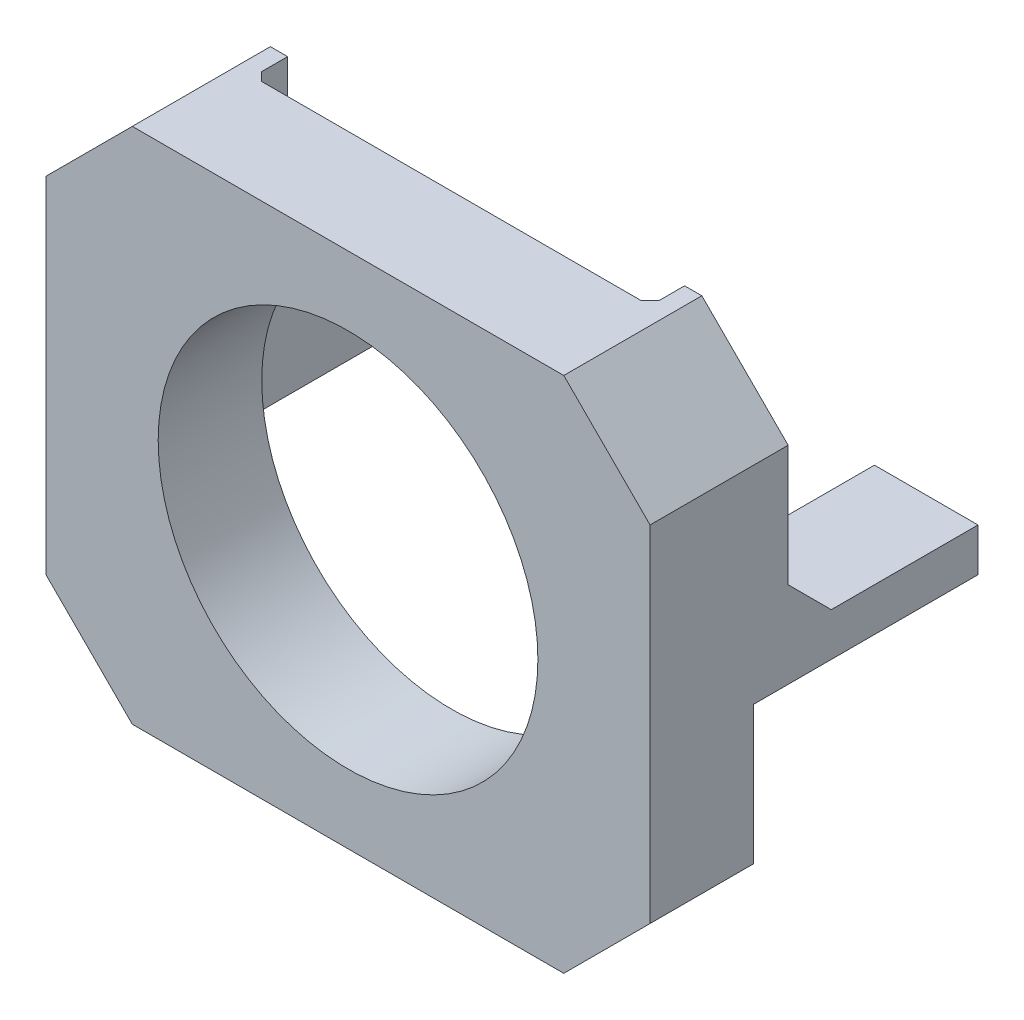
ISO-10303-21;
HEADER;
FILE_DESCRIPTION(('STEP AP214'),'2;1');
FILE_NAME('part.step','',(''),(''),'','','');
FILE_SCHEMA(('AUTOMOTIVE_DESIGN { 1 0 10303 214 1 1 1 1 }'));
ENDSEC;
DATA;
#1=APPLICATION_CONTEXT('core data for automotive mechanical design processes');
#2=APPLICATION_PROTOCOL_DEFINITION('international standard','automotive_design',2000,#1);
#3=PRODUCT_CONTEXT('',#1,'mechanical');
#4=PRODUCT('Part','Part','',(#3));
#5=PRODUCT_RELATED_PRODUCT_CATEGORY('part','',(#4));
#6=PRODUCT_DEFINITION_FORMATION('','',#4);
#7=PRODUCT_DEFINITION_CONTEXT('part definition',#1,'design');
#8=PRODUCT_DEFINITION('design','',#6,#7);
#9=PRODUCT_DEFINITION_SHAPE('','',#8);
#10=(LENGTH_UNIT() NAMED_UNIT(*) SI_UNIT(.MILLI.,.METRE.));
#11=(NAMED_UNIT(*) PLANE_ANGLE_UNIT() SI_UNIT($,.RADIAN.));
#12=(NAMED_UNIT(*) SI_UNIT($,.STERADIAN.) SOLID_ANGLE_UNIT());
#13=UNCERTAINTY_MEASURE_WITH_UNIT(LENGTH_MEASURE(1.E-05),#10,'distance_accuracy_value','');
#14=(GEOMETRIC_REPRESENTATION_CONTEXT(3) GLOBAL_UNCERTAINTY_ASSIGNED_CONTEXT((#13)) GLOBAL_UNIT_ASSIGNED_CONTEXT((#10,
#11,#12)) REPRESENTATION_CONTEXT('',''));
#15=CARTESIAN_POINT('',(0.,0.,0.));
#16=DIRECTION('',(0.,0.,1.));
#17=DIRECTION('',(1.,0.,0.));
#18=AXIS2_PLACEMENT_3D('',#15,#16,#17);
#19=CARTESIAN_POINT('',(0.,0.,0.));
#20=DIRECTION('',(0.,0.,1.));
#21=DIRECTION('',(1.,0.,0.));
#22=AXIS2_PLACEMENT_3D('',#19,#20,#21);
#23=PLANE('',#22);
#24=DIRECTION('',(1.,0.,0.));
#25=VECTOR('',#24,1.);
#26=CARTESIAN_POINT('',(0.,-2.,0.));
#27=LINE('',#26,#25);
#28=CARTESIAN_POINT('',(-17.5,-2.,0.));
#29=VERTEX_POINT('',#28);
#30=CARTESIAN_POINT('',(-11.,-2.,0.));
#31=VERTEX_POINT('',#30);
#32=EDGE_CURVE('E211',#29,#31,#27,.T.);
#33=ORIENTED_EDGE('',*,*,#32,.T.);
#34=DIRECTION('',(0.,1.,0.));
#35=VECTOR('',#34,1.);
#36=CARTESIAN_POINT('',(-11.,15.,0.));
#37=LINE('',#36,#35);
#38=CARTESIAN_POINT('',(-11.,0.,0.));
#39=VERTEX_POINT('',#38);
#40=EDGE_CURVE('E377',#31,#39,#37,.T.);
#41=ORIENTED_EDGE('',*,*,#40,.T.);
#42=CARTESIAN_POINT('',(0.,0.,0.));
#43=DIRECTION('',(0.,0.,1.));
#44=DIRECTION('',(1.,0.,0.));
#45=AXIS2_PLACEMENT_3D('',#42,#43,#44);
#46=CIRCLE('',#45,11.);
#47=CARTESIAN_POINT('',(11.,0.,0.));
#48=VERTEX_POINT('',#47);
#49=EDGE_CURVE('E268',#39,#48,#46,.T.);
#50=ORIENTED_EDGE('',*,*,#49,.T.);
#51=DIRECTION('',(0.,-1.,0.));
#52=VECTOR('',#51,1.);
#53=CARTESIAN_POINT('',(11.,0.,0.));
#54=LINE('',#53,#52);
#55=CARTESIAN_POINT('',(11.,-2.,0.));
#56=VERTEX_POINT('',#55);
#57=EDGE_CURVE('E369',#48,#56,#54,.T.);
#58=ORIENTED_EDGE('',*,*,#57,.T.);
#59=DIRECTION('',(-1.,0.,0.));
#60=VECTOR('',#59,1.);
#61=CARTESIAN_POINT('',(17.5,-2.,0.));
#62=LINE('',#61,#60);
#63=CARTESIAN_POINT('',(17.5,-2.,0.));
#64=VERTEX_POINT('',#63);
#65=EDGE_CURVE('E262',#64,#56,#62,.T.);
#66=ORIENTED_EDGE('',*,*,#65,.F.);
#67=DIRECTION('',(0.,1.,0.));
#68=VECTOR('',#67,1.);
#69=CARTESIAN_POINT('',(17.5,15.,0.));
#70=LINE('',#69,#68);
#71=CARTESIAN_POINT('',(17.5,-9.99999999999998,0.));
#72=VERTEX_POINT('',#71);
#73=EDGE_CURVE('E287',#72,#64,#70,.T.);
#74=ORIENTED_EDGE('',*,*,#73,.F.);
#75=DIRECTION('',(0.707106781186548,0.707106781186548,0.));
#76=VECTOR('',#75,1.);
#77=CARTESIAN_POINT('',(17.5,-9.99999999999998,0.));
#78=LINE('',#77,#76);
#79=CARTESIAN_POINT('',(12.5,-15.,0.));
#80=VERTEX_POINT('',#79);
#81=EDGE_CURVE('E319',#72,#80,#78,.F.);
#82=ORIENTED_EDGE('',*,*,#81,.T.);
#83=DIRECTION('',(1.,0.,0.));
#84=VECTOR('',#83,1.);
#85=CARTESIAN_POINT('',(-17.5,-15.,0.));
#86=LINE('',#85,#84);
#87=CARTESIAN_POINT('',(-12.5,-15.,0.));
#88=VERTEX_POINT('',#87);
#89=EDGE_CURVE('E295',#88,#80,#86,.T.);
#90=ORIENTED_EDGE('',*,*,#89,.F.);
#91=DIRECTION('',(0.707106781186548,-0.707106781186548,0.));
#92=VECTOR('',#91,1.);
#93=CARTESIAN_POINT('',(-12.5,-15.,0.));
#94=LINE('',#93,#92);
#95=CARTESIAN_POINT('',(-17.5,-9.99999999999998,0.));
#96=VERTEX_POINT('',#95);
#97=EDGE_CURVE('E317',#88,#96,#94,.F.);
#98=ORIENTED_EDGE('',*,*,#97,.T.);
#99=DIRECTION('',(0.,-1.,0.));
#100=VECTOR('',#99,1.);
#101=CARTESIAN_POINT('',(-17.5,15.,0.));
#102=LINE('',#101,#100);
#103=EDGE_CURVE('E309',#29,#96,#102,.T.);
#104=ORIENTED_EDGE('',*,*,#103,.F.);
#105=EDGE_LOOP('',(#33,#41,#50,#58,#66,#74,#82,#90,#98,#104));
#106=FACE_BOUND('',#105,.T.);
#107=ADVANCED_FACE('F47',(#106),#23,.F.);
#108=CARTESIAN_POINT('',(0.,0.,-2.));
#109=DIRECTION('',(0.,0.,-1.));
#110=DIRECTION('',(-1.,0.,0.));
#111=AXIS2_PLACEMENT_3D('',#108,#109,#110);
#112=PLANE('',#111);
#113=DIRECTION('',(0.,-1.,0.));
#114=VECTOR('',#113,1.);
#115=CARTESIAN_POINT('',(-11.5,0.,-2.));
#116=LINE('',#115,#114);
#117=CARTESIAN_POINT('',(-11.5,15.,-2.));
#118=VERTEX_POINT('',#117);
#119=CARTESIAN_POINT('',(-11.5,3.,-2.));
#120=VERTEX_POINT('',#119);
#121=EDGE_CURVE('E258',#118,#120,#116,.T.);
#122=ORIENTED_EDGE('',*,*,#121,.T.);
#123=DIRECTION('',(-1.,0.,0.));
#124=VECTOR('',#123,1.);
#125=CARTESIAN_POINT('',(0.,2.99999999999999,-2.));
#126=LINE('',#125,#124);
#127=CARTESIAN_POINT('',(-17.5,3.,-2.));
#128=VERTEX_POINT('',#127);
#129=EDGE_CURVE('E351',#120,#128,#126,.T.);
#130=ORIENTED_EDGE('',*,*,#129,.T.);
#131=DIRECTION('',(0.,1.,0.));
#132=VECTOR('',#131,1.);
#133=CARTESIAN_POINT('',(-17.5,0.,-2.));
#134=LINE('',#133,#132);
#135=CARTESIAN_POINT('',(-17.5,9.99999999999998,-2.));
#136=VERTEX_POINT('',#135);
#137=EDGE_CURVE('E215',#128,#136,#134,.T.);
#138=ORIENTED_EDGE('',*,*,#137,.T.);
#139=DIRECTION('',(-0.707106781186548,-0.707106781186548,0.));
#140=VECTOR('',#139,1.);
#141=CARTESIAN_POINT('',(-13.75,13.75,-2.));
#142=LINE('',#141,#140);
#143=CARTESIAN_POINT('',(-12.5,15.,-2.));
#144=VERTEX_POINT('',#143);
#145=EDGE_CURVE('E339',#136,#144,#142,.F.);
#146=ORIENTED_EDGE('',*,*,#145,.T.);
#147=DIRECTION('',(1.,0.,0.));
#148=VECTOR('',#147,1.);
#149=CARTESIAN_POINT('',(0.,15.,-2.));
#150=LINE('',#149,#148);
#151=EDGE_CURVE('E256',#144,#118,#150,.T.);
#152=ORIENTED_EDGE('',*,*,#151,.T.);
#153=EDGE_LOOP('',(#122,#130,#138,#146,#152));
#154=FACE_BOUND('',#153,.T.);
#155=ADVANCED_FACE('F407',(#154),#112,.T.);
#156=EDGE_CURVE('E288',#48,#39,#46,.T.);
#157=ORIENTED_EDGE('',*,*,#156,.T.);
#158=DIRECTION('',(0.,1.,0.));
#159=VECTOR('',#158,1.);
#160=CARTESIAN_POINT('',(-11.,15.,0.));
#161=LINE('',#160,#159);
#162=CARTESIAN_POINT('',(-11.,15.,0.));
#163=VERTEX_POINT('',#162);
#164=EDGE_CURVE('E375',#39,#163,#161,.T.);
#165=ORIENTED_EDGE('',*,*,#164,.T.);
#166=DIRECTION('',(-1.,0.,0.));
#167=VECTOR('',#166,1.);
#168=CARTESIAN_POINT('',(-17.5,15.,0.));
#169=LINE('',#168,#167);
#170=CARTESIAN_POINT('',(11.,15.,0.));
#171=VERTEX_POINT('',#170);
#172=EDGE_CURVE('E306',#171,#163,#169,.T.);
#173=ORIENTED_EDGE('',*,*,#172,.F.);
#174=DIRECTION('',(0.,-1.,0.));
#175=VECTOR('',#174,1.);
#176=CARTESIAN_POINT('',(11.,0.,0.));
#177=LINE('',#176,#175);
#178=EDGE_CURVE('E372',#171,#48,#177,.T.);
#179=ORIENTED_EDGE('',*,*,#178,.T.);
#180=EDGE_LOOP('',(#157,#165,#173,#179));
#181=FACE_BOUND('',#180,.T.);
#182=ADVANCED_FACE('F438',(#181),#23,.F.);
#183=CARTESIAN_POINT('',(0.,0.,6.));
#184=DIRECTION('',(0.,0.,1.));
#185=DIRECTION('',(1.,0.,0.));
#186=AXIS2_PLACEMENT_3D('',#183,#184,#185);
#187=PLANE('',#186);
#188=DIRECTION('',(1.,0.,0.));
#189=VECTOR('',#188,1.);
#190=CARTESIAN_POINT('',(-17.5,-15.,6.));
#191=LINE('',#190,#189);
#192=CARTESIAN_POINT('',(-12.5,-15.,6.));
#193=VERTEX_POINT('',#192);
#194=CARTESIAN_POINT('',(12.5,-15.,6.));
#195=VERTEX_POINT('',#194);
#196=EDGE_CURVE('E301',#193,#195,#191,.T.);
#197=ORIENTED_EDGE('',*,*,#196,.T.);
#198=DIRECTION('',(-0.707106781186548,-0.707106781186548,0.));
#199=VECTOR('',#198,1.);
#200=CARTESIAN_POINT('',(13.75,-13.75,6.));
#201=LINE('',#200,#199);
#202=CARTESIAN_POINT('',(17.5,-9.99999999999998,6.));
#203=VERTEX_POINT('',#202);
#204=EDGE_CURVE('E332',#195,#203,#201,.F.);
#205=ORIENTED_EDGE('',*,*,#204,.T.);
#206=DIRECTION('',(0.,1.,0.));
#207=VECTOR('',#206,1.);
#208=CARTESIAN_POINT('',(17.5,15.,6.));
#209=LINE('',#208,#207);
#210=CARTESIAN_POINT('',(17.5,9.99999999999998,6.));
#211=VERTEX_POINT('',#210);
#212=EDGE_CURVE('E291',#203,#211,#209,.T.);
#213=ORIENTED_EDGE('',*,*,#212,.T.);
#214=DIRECTION('',(0.707106781186548,-0.707106781186548,0.));
#215=VECTOR('',#214,1.);
#216=CARTESIAN_POINT('',(13.75,13.75,6.));
#217=LINE('',#216,#215);
#218=CARTESIAN_POINT('',(12.5,15.,6.));
#219=VERTEX_POINT('',#218);
#220=EDGE_CURVE('E326',#211,#219,#217,.F.);
#221=ORIENTED_EDGE('',*,*,#220,.T.);
#222=DIRECTION('',(-1.,0.,0.));
#223=VECTOR('',#222,1.);
#224=CARTESIAN_POINT('',(-17.5,15.,6.));
#225=LINE('',#224,#223);
#226=CARTESIAN_POINT('',(-12.5,15.,6.));
#227=VERTEX_POINT('',#226);
#228=EDGE_CURVE('E294',#219,#227,#225,.T.);
#229=ORIENTED_EDGE('',*,*,#228,.T.);
#230=DIRECTION('',(0.707106781186548,0.707106781186548,0.));
#231=VECTOR('',#230,1.);
#232=CARTESIAN_POINT('',(-13.75,13.75,6.));
#233=LINE('',#232,#231);
#234=CARTESIAN_POINT('',(-17.5,9.99999999999998,6.));
#235=VERTEX_POINT('',#234);
#236=EDGE_CURVE('E328',#227,#235,#233,.F.);
#237=ORIENTED_EDGE('',*,*,#236,.T.);
#238=DIRECTION('',(0.,-1.,0.));
#239=VECTOR('',#238,1.);
#240=CARTESIAN_POINT('',(-17.5,15.,6.));
#241=LINE('',#240,#239);
#242=CARTESIAN_POINT('',(-17.5,-9.99999999999998,6.));
#243=VERTEX_POINT('',#242);
#244=EDGE_CURVE('E298',#235,#243,#241,.T.);
#245=ORIENTED_EDGE('',*,*,#244,.T.);
#246=DIRECTION('',(-0.707106781186548,0.707106781186548,0.));
#247=VECTOR('',#246,1.);
#248=CARTESIAN_POINT('',(-13.75,-13.75,6.));
#249=LINE('',#248,#247);
#250=EDGE_CURVE('E330',#243,#193,#249,.F.);
#251=ORIENTED_EDGE('',*,*,#250,.T.);
#252=EDGE_LOOP('',(#197,#205,#213,#221,#229,#237,#245,#251));
#253=FACE_BOUND('',#252,.T.);
#254=CARTESIAN_POINT('',(0.,0.,6.));
#255=DIRECTION('',(0.,0.,1.));
#256=DIRECTION('',(1.,0.,0.));
#257=AXIS2_PLACEMENT_3D('',#254,#255,#256);
#258=CIRCLE('',#257,11.);
#259=CARTESIAN_POINT('',(11.,0.,6.));
#260=VERTEX_POINT('',#259);
#261=EDGE_CURVE('E284',#260,#260,#258,.T.);
#262=ORIENTED_EDGE('',*,*,#261,.F.);
#263=EDGE_LOOP('',(#262));
#264=FACE_BOUND('',#263,.T.);
#265=ADVANCED_FACE('F418',(#253,#264),#187,.T.);
#266=CARTESIAN_POINT('',(17.5,15.,6.));
#267=DIRECTION('',(-1.,0.,0.));
#268=DIRECTION('',(0.,0.,1.));
#269=AXIS2_PLACEMENT_3D('',#266,#267,#268);
#270=PLANE('',#269);
#271=ORIENTED_EDGE('',*,*,#212,.F.);
#272=DIRECTION('',(0.,0.,-1.));
#273=VECTOR('',#272,1.);
#274=CARTESIAN_POINT('',(17.5,-9.99999999999998,6.));
#275=LINE('',#274,#273);
#276=EDGE_CURVE('E314',#203,#72,#275,.T.);
#277=ORIENTED_EDGE('',*,*,#276,.T.);
#278=ORIENTED_EDGE('',*,*,#73,.T.);
#279=DIRECTION('',(0.,0.,1.));
#280=VECTOR('',#279,1.);
#281=CARTESIAN_POINT('',(17.5,-2.,-2.));
#282=LINE('',#281,#280);
#283=CARTESIAN_POINT('',(17.5,-2.,-13.));
#284=VERTEX_POINT('',#283);
#285=EDGE_CURVE('E272',#284,#64,#282,.T.);
#286=ORIENTED_EDGE('',*,*,#285,.F.);
#287=DIRECTION('',(0.,1.,0.));
#288=VECTOR('',#287,1.);
#289=CARTESIAN_POINT('',(17.5,-2.,-13.));
#290=LINE('',#289,#288);
#291=CARTESIAN_POINT('',(17.5,0.499999999999998,-13.));
#292=VERTEX_POINT('',#291);
#293=EDGE_CURVE('E245',#284,#292,#290,.T.);
#294=ORIENTED_EDGE('',*,*,#293,.T.);
#295=DIRECTION('',(0.,0.,1.));
#296=VECTOR('',#295,1.);
#297=CARTESIAN_POINT('',(17.5,0.499999999999998,-13.));
#298=LINE('',#297,#296);
#299=CARTESIAN_POINT('',(17.5,0.499999999999998,-4.49999999999999));
#300=VERTEX_POINT('',#299);
#301=EDGE_CURVE('E246',#292,#300,#298,.T.);
#302=ORIENTED_EDGE('',*,*,#301,.T.);
#303=DIRECTION('',(0.,0.707106781186548,0.707106781186548));
#304=VECTOR('',#303,1.);
#305=CARTESIAN_POINT('',(17.5,13.,8.00000000000001));
#306=LINE('',#305,#304);
#307=CARTESIAN_POINT('',(17.5,2.99999999999999,-2.));
#308=VERTEX_POINT('',#307);
#309=EDGE_CURVE('E364',#300,#308,#306,.T.);
#310=ORIENTED_EDGE('',*,*,#309,.T.);
#311=DIRECTION('',(0.,-1.,0.));
#312=VECTOR('',#311,1.);
#313=CARTESIAN_POINT('',(17.5,15.,-2.));
#314=LINE('',#313,#312);
#315=CARTESIAN_POINT('',(17.5,9.99999999999998,-2.));
#316=VERTEX_POINT('',#315);
#317=EDGE_CURVE('E275',#316,#308,#314,.T.);
#318=ORIENTED_EDGE('',*,*,#317,.F.);
#319=DIRECTION('',(0.,0.,1.));
#320=VECTOR('',#319,1.);
#321=CARTESIAN_POINT('',(17.5,9.99999999999998,6.));
#322=LINE('',#321,#320);
#323=EDGE_CURVE('E304',#316,#211,#322,.T.);
#324=ORIENTED_EDGE('',*,*,#323,.T.);
#325=EDGE_LOOP('',(#271,#277,#278,#286,#294,#302,#310,#318,#324));
#326=FACE_BOUND('',#325,.T.);
#327=ADVANCED_FACE('F470',(#326),#270,.F.);
#328=CARTESIAN_POINT('',(-17.5,15.,6.));
#329=DIRECTION('',(0.,-1.,0.));
#330=DIRECTION('',(0.,0.,-1.));
#331=AXIS2_PLACEMENT_3D('',#328,#329,#330);
#332=PLANE('',#331);
#333=ORIENTED_EDGE('',*,*,#151,.F.);
#334=DIRECTION('',(0.,0.,1.));
#335=VECTOR('',#334,1.);
#336=CARTESIAN_POINT('',(-12.5,15.,6.));
#337=LINE('',#336,#335);
#338=EDGE_CURVE('E344',#144,#227,#337,.T.);
#339=ORIENTED_EDGE('',*,*,#338,.T.);
#340=ORIENTED_EDGE('',*,*,#228,.F.);
#341=DIRECTION('',(0.,0.,-1.));
#342=VECTOR('',#341,1.);
#343=CARTESIAN_POINT('',(12.5,15.,6.));
#344=LINE('',#343,#342);
#345=CARTESIAN_POINT('',(12.5,15.,-2.));
#346=VERTEX_POINT('',#345);
#347=EDGE_CURVE('E341',#219,#346,#344,.T.);
#348=ORIENTED_EDGE('',*,*,#347,.T.);
#349=DIRECTION('',(-1.,0.,0.));
#350=VECTOR('',#349,1.);
#351=CARTESIAN_POINT('',(17.5,15.,-2.));
#352=LINE('',#351,#350);
#353=CARTESIAN_POINT('',(11.5,15.,-2.));
#354=VERTEX_POINT('',#353);
#355=EDGE_CURVE('E280',#346,#354,#352,.T.);
#356=ORIENTED_EDGE('',*,*,#355,.T.);
#357=DIRECTION('',(0.,0.,1.));
#358=VECTOR('',#357,1.);
#359=CARTESIAN_POINT('',(11.5,15.,-2.));
#360=LINE('',#359,#358);
#361=CARTESIAN_POINT('',(11.5,15.,-0.5));
#362=VERTEX_POINT('',#361);
#363=EDGE_CURVE('E270',#354,#362,#360,.T.);
#364=ORIENTED_EDGE('',*,*,#363,.T.);
#365=DIRECTION('',(-0.707106781186548,0.,0.707106781186547));
#366=VECTOR('',#365,1.);
#367=CARTESIAN_POINT('',(-6.25000000000001,15.,17.25));
#368=LINE('',#367,#366);
#369=EDGE_CURVE('E11',#362,#171,#368,.T.);
#370=ORIENTED_EDGE('',*,*,#369,.T.);
#371=ORIENTED_EDGE('',*,*,#172,.T.);
#372=DIRECTION('',(0.707106781186548,0.,0.707106781186548));
#373=VECTOR('',#372,1.);
#374=CARTESIAN_POINT('',(-11.25,15.,-0.249999999999998));
#375=LINE('',#374,#373);
#376=CARTESIAN_POINT('',(-11.5,15.,-0.499999999999994));
#377=VERTEX_POINT('',#376);
#378=EDGE_CURVE('E382',#163,#377,#375,.F.);
#379=ORIENTED_EDGE('',*,*,#378,.T.);
#380=DIRECTION('',(0.,0.,1.));
#381=VECTOR('',#380,1.);
#382=CARTESIAN_POINT('',(-11.5,15.,-2.));
#383=LINE('',#382,#381);
#384=EDGE_CURVE('E265',#118,#377,#383,.T.);
#385=ORIENTED_EDGE('',*,*,#384,.F.);
#386=EDGE_LOOP('',(#333,#339,#340,#348,#356,#364,#370,#371,#379,#385));
#387=FACE_BOUND('',#386,.T.);
#388=ADVANCED_FACE('F387',(#387),#332,.F.);
#389=CARTESIAN_POINT('',(-17.5,15.,6.));
#390=DIRECTION('',(1.,0.,0.));
#391=DIRECTION('',(0.,0.,-1.));
#392=AXIS2_PLACEMENT_3D('',#389,#390,#391);
#393=PLANE('',#392);
#394=ORIENTED_EDGE('',*,*,#103,.T.);
#395=DIRECTION('',(0.,0.,1.));
#396=VECTOR('',#395,1.);
#397=CARTESIAN_POINT('',(-17.5,-9.99999999999998,6.));
#398=LINE('',#397,#396);
#399=EDGE_CURVE('E337',#96,#243,#398,.T.);
#400=ORIENTED_EDGE('',*,*,#399,.T.);
#401=ORIENTED_EDGE('',*,*,#244,.F.);
#402=DIRECTION('',(0.,0.,-1.));
#403=VECTOR('',#402,1.);
#404=CARTESIAN_POINT('',(-17.5,9.99999999999998,6.));
#405=LINE('',#404,#403);
#406=EDGE_CURVE('E334',#235,#136,#405,.T.);
#407=ORIENTED_EDGE('',*,*,#406,.T.);
#408=ORIENTED_EDGE('',*,*,#137,.F.);
#409=DIRECTION('',(0.,-0.707106781186548,-0.707106781186548));
#410=VECTOR('',#409,1.);
#411=CARTESIAN_POINT('',(-17.5,13.,8.));
#412=LINE('',#411,#410);
#413=CARTESIAN_POINT('',(-17.5,0.500000000000003,-4.5));
#414=VERTEX_POINT('',#413);
#415=EDGE_CURVE('E360',#128,#414,#412,.T.);
#416=ORIENTED_EDGE('',*,*,#415,.T.);
#417=DIRECTION('',(0.,0.,1.));
#418=VECTOR('',#417,1.);
#419=CARTESIAN_POINT('',(-17.5,0.500000000000003,-13.));
#420=LINE('',#419,#418);
#421=CARTESIAN_POINT('',(-17.5,0.500000000000003,-13.));
#422=VERTEX_POINT('',#421);
#423=EDGE_CURVE('E221',#422,#414,#420,.T.);
#424=ORIENTED_EDGE('',*,*,#423,.F.);
#425=DIRECTION('',(0.,1.,0.));
#426=VECTOR('',#425,1.);
#427=CARTESIAN_POINT('',(-17.5,0.,-13.));
#428=LINE('',#427,#426);
#429=CARTESIAN_POINT('',(-17.5,-2.,-13.));
#430=VERTEX_POINT('',#429);
#431=EDGE_CURVE('E218',#430,#422,#428,.T.);
#432=ORIENTED_EDGE('',*,*,#431,.F.);
#433=DIRECTION('',(0.,0.,1.));
#434=VECTOR('',#433,1.);
#435=CARTESIAN_POINT('',(-17.5,-2.,-2.));
#436=LINE('',#435,#434);
#437=EDGE_CURVE('E203',#430,#29,#436,.T.);
#438=ORIENTED_EDGE('',*,*,#437,.T.);
#439=EDGE_LOOP('',(#394,#400,#401,#407,#408,#416,#424,#432,#438));
#440=FACE_BOUND('',#439,.T.);
#441=ADVANCED_FACE('F219',(#440),#393,.F.);
#442=CARTESIAN_POINT('',(-17.5,-15.,6.));
#443=DIRECTION('',(0.,1.,0.));
#444=DIRECTION('',(0.,0.,1.));
#445=AXIS2_PLACEMENT_3D('',#442,#443,#444);
#446=PLANE('',#445);
#447=ORIENTED_EDGE('',*,*,#89,.T.);
#448=DIRECTION('',(0.,0.,1.));
#449=VECTOR('',#448,1.);
#450=CARTESIAN_POINT('',(12.5,-15.,6.));
#451=LINE('',#450,#449);
#452=EDGE_CURVE('E324',#80,#195,#451,.T.);
#453=ORIENTED_EDGE('',*,*,#452,.T.);
#454=ORIENTED_EDGE('',*,*,#196,.F.);
#455=DIRECTION('',(0.,0.,-1.));
#456=VECTOR('',#455,1.);
#457=CARTESIAN_POINT('',(-12.5,-15.,6.));
#458=LINE('',#457,#456);
#459=EDGE_CURVE('E321',#193,#88,#458,.T.);
#460=ORIENTED_EDGE('',*,*,#459,.T.);
#461=EDGE_LOOP('',(#447,#453,#454,#460));
#462=FACE_BOUND('',#461,.T.);
#463=ADVANCED_FACE('F447',(#462),#446,.F.);
#464=CARTESIAN_POINT('',(0.,0.,6.));
#465=DIRECTION('',(0.,0.,-1.));
#466=DIRECTION('',(-1.,0.,0.));
#467=AXIS2_PLACEMENT_3D('',#464,#465,#466);
#468=CYLINDRICAL_SURFACE('',#467,11.);
#469=ORIENTED_EDGE('',*,*,#261,.T.);
#470=EDGE_LOOP('',(#469));
#471=FACE_BOUND('',#470,.T.);
#472=ORIENTED_EDGE('',*,*,#156,.F.);
#473=ORIENTED_EDGE('',*,*,#49,.F.);
#474=EDGE_LOOP('',(#472,#473));
#475=FACE_BOUND('',#474,.T.);
#476=ADVANCED_FACE('F444',(#471,#475),#468,.F.);
#477=CARTESIAN_POINT('',(17.5,-2.,-2.));
#478=DIRECTION('',(0.,1.,0.));
#479=DIRECTION('',(0.,0.,1.));
#480=AXIS2_PLACEMENT_3D('',#477,#478,#479);
#481=PLANE('',#480);
#482=ORIENTED_EDGE('',*,*,#65,.T.);
#483=DIRECTION('',(0.707106781186548,0.,-0.707106781186547));
#484=VECTOR('',#483,1.);
#485=CARTESIAN_POINT('',(15.25,-2.,-4.25));
#486=LINE('',#485,#484);
#487=CARTESIAN_POINT('',(11.5,-2.,-0.5));
#488=VERTEX_POINT('',#487);
#489=EDGE_CURVE('E56',#56,#488,#486,.T.);
#490=ORIENTED_EDGE('',*,*,#489,.T.);
#491=DIRECTION('',(0.,0.,1.));
#492=VECTOR('',#491,1.);
#493=CARTESIAN_POINT('',(11.5,-2.,-2.));
#494=LINE('',#493,#492);
#495=CARTESIAN_POINT('',(11.5,-2.,-13.));
#496=VERTEX_POINT('',#495);
#497=EDGE_CURVE('E241',#496,#488,#494,.T.);
#498=ORIENTED_EDGE('',*,*,#497,.F.);
#499=DIRECTION('',(-1.,0.,0.));
#500=VECTOR('',#499,1.);
#501=CARTESIAN_POINT('',(17.5,-2.,-13.));
#502=LINE('',#501,#500);
#503=EDGE_CURVE('E251',#284,#496,#502,.T.);
#504=ORIENTED_EDGE('',*,*,#503,.F.);
#505=ORIENTED_EDGE('',*,*,#285,.T.);
#506=EDGE_LOOP('',(#482,#490,#498,#504,#505));
#507=FACE_BOUND('',#506,.T.);
#508=ADVANCED_FACE('F446',(#507),#481,.F.);
#509=CARTESIAN_POINT('',(11.5,15.,-2.));
#510=DIRECTION('',(-1.,0.,0.));
#511=DIRECTION('',(0.,-1.,0.));
#512=AXIS2_PLACEMENT_3D('',#509,#510,#511);
#513=PLANE('',#512);
#514=ORIENTED_EDGE('',*,*,#497,.T.);
#515=DIRECTION('',(0.,1.,0.));
#516=VECTOR('',#515,1.);
#517=CARTESIAN_POINT('',(11.5,15.,-0.5));
#518=LINE('',#517,#516);
#519=EDGE_CURVE('E69',#488,#362,#518,.T.);
#520=ORIENTED_EDGE('',*,*,#519,.T.);
#521=ORIENTED_EDGE('',*,*,#363,.F.);
#522=DIRECTION('',(0.,-1.,0.));
#523=VECTOR('',#522,1.);
#524=CARTESIAN_POINT('',(11.5,15.,-2.));
#525=LINE('',#524,#523);
#526=CARTESIAN_POINT('',(11.5,2.99999999999999,-2.));
#527=VERTEX_POINT('',#526);
#528=EDGE_CURVE('E277',#354,#527,#525,.T.);
#529=ORIENTED_EDGE('',*,*,#528,.T.);
#530=DIRECTION('',(0.,-0.707106781186548,-0.707106781186548));
#531=VECTOR('',#530,1.);
#532=CARTESIAN_POINT('',(11.5,2.99999999999999,-2.));
#533=LINE('',#532,#531);
#534=CARTESIAN_POINT('',(11.5,0.499999999999999,-4.49999999999999));
#535=VERTEX_POINT('',#534);
#536=EDGE_CURVE('E362',#527,#535,#533,.T.);
#537=ORIENTED_EDGE('',*,*,#536,.T.);
#538=DIRECTION('',(0.,0.,1.));
#539=VECTOR('',#538,1.);
#540=CARTESIAN_POINT('',(11.5,0.499999999999999,-13.));
#541=LINE('',#540,#539);
#542=CARTESIAN_POINT('',(11.5,0.499999999999999,-13.));
#543=VERTEX_POINT('',#542);
#544=EDGE_CURVE('E242',#543,#535,#541,.T.);
#545=ORIENTED_EDGE('',*,*,#544,.F.);
#546=DIRECTION('',(0.,1.,0.));
#547=VECTOR('',#546,1.);
#548=CARTESIAN_POINT('',(11.5,-2.,-13.));
#549=LINE('',#548,#547);
#550=EDGE_CURVE('E232',#496,#543,#549,.T.);
#551=ORIENTED_EDGE('',*,*,#550,.F.);
#552=EDGE_LOOP('',(#514,#520,#521,#529,#537,#545,#551));
#553=FACE_BOUND('',#552,.T.);
#554=ADVANCED_FACE('F431',(#553),#513,.T.);
#555=CARTESIAN_POINT('',(0.,0.,-2.));
#556=DIRECTION('',(0.,0.,1.));
#557=DIRECTION('',(1.,0.,0.));
#558=AXIS2_PLACEMENT_3D('',#555,#556,#557);
#559=PLANE('',#558);
#560=ORIENTED_EDGE('',*,*,#317,.T.);
#561=DIRECTION('',(-1.,0.,0.));
#562=VECTOR('',#561,1.);
#563=CARTESIAN_POINT('',(0.,2.99999999999999,-2.));
#564=LINE('',#563,#562);
#565=EDGE_CURVE('E353',#308,#527,#564,.T.);
#566=ORIENTED_EDGE('',*,*,#565,.T.);
#567=ORIENTED_EDGE('',*,*,#528,.F.);
#568=ORIENTED_EDGE('',*,*,#355,.F.);
#569=DIRECTION('',(-0.707106781186548,0.707106781186548,0.));
#570=VECTOR('',#569,1.);
#571=CARTESIAN_POINT('',(12.5,15.,-2.));
#572=LINE('',#571,#570);
#573=EDGE_CURVE('E346',#346,#316,#572,.F.);
#574=ORIENTED_EDGE('',*,*,#573,.T.);
#575=EDGE_LOOP('',(#560,#566,#567,#568,#574));
#576=FACE_BOUND('',#575,.T.);
#577=ADVANCED_FACE('F428',(#576),#559,.F.);
#578=CARTESIAN_POINT('',(-11.5,0.,-2.));
#579=DIRECTION('',(-1.,0.,0.));
#580=DIRECTION('',(0.,0.,1.));
#581=AXIS2_PLACEMENT_3D('',#578,#579,#580);
#582=PLANE('',#581);
#583=ORIENTED_EDGE('',*,*,#384,.T.);
#584=DIRECTION('',(0.,-1.,0.));
#585=VECTOR('',#584,1.);
#586=CARTESIAN_POINT('',(-11.5,-2.,-0.499999999999994));
#587=LINE('',#586,#585);
#588=CARTESIAN_POINT('',(-11.5,-2.,-0.499999999999994));
#589=VERTEX_POINT('',#588);
#590=EDGE_CURVE('E366',#377,#589,#587,.T.);
#591=ORIENTED_EDGE('',*,*,#590,.T.);
#592=DIRECTION('',(0.,0.,1.));
#593=VECTOR('',#592,1.);
#594=CARTESIAN_POINT('',(-11.5,-2.,-2.));
#595=LINE('',#594,#593);
#596=CARTESIAN_POINT('',(-11.5,-2.,-13.));
#597=VERTEX_POINT('',#596);
#598=EDGE_CURVE('E214',#597,#589,#595,.T.);
#599=ORIENTED_EDGE('',*,*,#598,.F.);
#600=DIRECTION('',(0.,1.,0.));
#601=VECTOR('',#600,1.);
#602=CARTESIAN_POINT('',(-11.5,0.,-13.));
#603=LINE('',#602,#601);
#604=CARTESIAN_POINT('',(-11.5,0.500000000000002,-13.));
#605=VERTEX_POINT('',#604);
#606=EDGE_CURVE('E228',#597,#605,#603,.T.);
#607=ORIENTED_EDGE('',*,*,#606,.T.);
#608=DIRECTION('',(0.,0.,1.));
#609=VECTOR('',#608,1.);
#610=CARTESIAN_POINT('',(-11.5,0.500000000000002,-13.));
#611=LINE('',#610,#609);
#612=CARTESIAN_POINT('',(-11.5,0.500000000000002,-4.5));
#613=VERTEX_POINT('',#612);
#614=EDGE_CURVE('E237',#605,#613,#611,.T.);
#615=ORIENTED_EDGE('',*,*,#614,.T.);
#616=DIRECTION('',(0.,0.707106781186548,0.707106781186548));
#617=VECTOR('',#616,1.);
#618=CARTESIAN_POINT('',(-11.5,1.5,-3.5));
#619=LINE('',#618,#617);
#620=EDGE_CURVE('E358',#613,#120,#619,.T.);
#621=ORIENTED_EDGE('',*,*,#620,.T.);
#622=ORIENTED_EDGE('',*,*,#121,.F.);
#623=EDGE_LOOP('',(#583,#591,#599,#607,#615,#621,#622));
#624=FACE_BOUND('',#623,.T.);
#625=ADVANCED_FACE('F394',(#624),#582,.F.);
#626=CARTESIAN_POINT('',(0.,-2.,-2.));
#627=DIRECTION('',(0.,-1.,0.));
#628=DIRECTION('',(1.,0.,0.));
#629=AXIS2_PLACEMENT_3D('',#626,#627,#628);
#630=PLANE('',#629);
#631=ORIENTED_EDGE('',*,*,#32,.F.);
#632=ORIENTED_EDGE('',*,*,#437,.F.);
#633=DIRECTION('',(1.,0.,0.));
#634=VECTOR('',#633,1.);
#635=CARTESIAN_POINT('',(0.,-2.,-13.));
#636=LINE('',#635,#634);
#637=EDGE_CURVE('E208',#430,#597,#636,.T.);
#638=ORIENTED_EDGE('',*,*,#637,.T.);
#639=ORIENTED_EDGE('',*,*,#598,.T.);
#640=DIRECTION('',(-0.707106781186548,0.,-0.707106781186548));
#641=VECTOR('',#640,1.);
#642=CARTESIAN_POINT('',(-11.5,-2.,-0.499999999999993));
#643=LINE('',#642,#641);
#644=EDGE_CURVE('E380',#589,#31,#643,.F.);
#645=ORIENTED_EDGE('',*,*,#644,.T.);
#646=EDGE_LOOP('',(#631,#632,#638,#639,#645));
#647=FACE_BOUND('',#646,.T.);
#648=ADVANCED_FACE('F205',(#647),#630,.T.);
#649=CARTESIAN_POINT('',(0.,0.499999999999999,-13.));
#650=DIRECTION('',(0.,-1.,0.));
#651=DIRECTION('',(1.,0.,0.));
#652=AXIS2_PLACEMENT_3D('',#649,#650,#651);
#653=PLANE('',#652);
#654=ORIENTED_EDGE('',*,*,#423,.T.);
#655=DIRECTION('',(1.,0.,0.));
#656=VECTOR('',#655,1.);
#657=CARTESIAN_POINT('',(0.,0.499999999999999,-4.5));
#658=LINE('',#657,#656);
#659=EDGE_CURVE('E348',#414,#613,#658,.T.);
#660=ORIENTED_EDGE('',*,*,#659,.T.);
#661=ORIENTED_EDGE('',*,*,#614,.F.);
#662=DIRECTION('',(1.,0.,0.));
#663=VECTOR('',#662,1.);
#664=CARTESIAN_POINT('',(0.,0.499999999999999,-13.));
#665=LINE('',#664,#663);
#666=EDGE_CURVE('E224',#422,#605,#665,.T.);
#667=ORIENTED_EDGE('',*,*,#666,.F.);
#668=EDGE_LOOP('',(#654,#660,#661,#667));
#669=FACE_BOUND('',#668,.T.);
#670=ADVANCED_FACE('F399',(#669),#653,.F.);
#671=CARTESIAN_POINT('',(0.,0.,-13.));
#672=DIRECTION('',(0.,0.,-1.));
#673=DIRECTION('',(-1.,0.,0.));
#674=AXIS2_PLACEMENT_3D('',#671,#672,#673);
#675=PLANE('',#674);
#676=ORIENTED_EDGE('',*,*,#637,.F.);
#677=ORIENTED_EDGE('',*,*,#431,.T.);
#678=ORIENTED_EDGE('',*,*,#666,.T.);
#679=ORIENTED_EDGE('',*,*,#606,.F.);
#680=EDGE_LOOP('',(#676,#677,#678,#679));
#681=FACE_BOUND('',#680,.T.);
#682=ADVANCED_FACE('F226',(#681),#675,.T.);
#683=CARTESIAN_POINT('',(17.5,0.499999999999998,-13.));
#684=DIRECTION('',(0.,1.,0.));
#685=DIRECTION('',(-1.,0.,0.));
#686=AXIS2_PLACEMENT_3D('',#683,#684,#685);
#687=PLANE('',#686);
#688=ORIENTED_EDGE('',*,*,#544,.T.);
#689=DIRECTION('',(1.,0.,0.));
#690=VECTOR('',#689,1.);
#691=CARTESIAN_POINT('',(17.5,0.499999999999998,-4.49999999999999));
#692=LINE('',#691,#690);
#693=EDGE_CURVE('E356',#535,#300,#692,.T.);
#694=ORIENTED_EDGE('',*,*,#693,.T.);
#695=ORIENTED_EDGE('',*,*,#301,.F.);
#696=DIRECTION('',(-1.,0.,0.));
#697=VECTOR('',#696,1.);
#698=CARTESIAN_POINT('',(17.5,0.499999999999998,-13.));
#699=LINE('',#698,#697);
#700=EDGE_CURVE('E229',#292,#543,#699,.T.);
#701=ORIENTED_EDGE('',*,*,#700,.T.);
#702=EDGE_LOOP('',(#688,#694,#695,#701));
#703=FACE_BOUND('',#702,.T.);
#704=ADVANCED_FACE('F584',(#703),#687,.T.);
#705=CARTESIAN_POINT('',(0.,0.,-13.));
#706=DIRECTION('',(0.,0.,-1.));
#707=DIRECTION('',(-1.,0.,0.));
#708=AXIS2_PLACEMENT_3D('',#705,#706,#707);
#709=PLANE('',#708);
#710=ORIENTED_EDGE('',*,*,#700,.F.);
#711=ORIENTED_EDGE('',*,*,#293,.F.);
#712=ORIENTED_EDGE('',*,*,#503,.T.);
#713=ORIENTED_EDGE('',*,*,#550,.T.);
#714=EDGE_LOOP('',(#710,#711,#712,#713));
#715=FACE_BOUND('',#714,.T.);
#716=ADVANCED_FACE('F489',(#715),#709,.T.);
#717=CARTESIAN_POINT('',(17.5,-9.99999999999998,6.));
#718=DIRECTION('',(-0.707106781186547,0.707106781186547,0.));
#719=DIRECTION('',(0.,0.,-1.));
#720=AXIS2_PLACEMENT_3D('',#717,#718,#719);
#721=PLANE('',#720);
#722=ORIENTED_EDGE('',*,*,#204,.F.);
#723=ORIENTED_EDGE('',*,*,#452,.F.);
#724=ORIENTED_EDGE('',*,*,#81,.F.);
#725=ORIENTED_EDGE('',*,*,#276,.F.);
#726=EDGE_LOOP('',(#722,#723,#724,#725));
#727=FACE_BOUND('',#726,.T.);
#728=ADVANCED_FACE('F482',(#727),#721,.F.);
#729=CARTESIAN_POINT('',(-12.5,-15.,6.));
#730=DIRECTION('',(0.707106781186547,0.707106781186547,0.));
#731=DIRECTION('',(0.,0.,-1.));
#732=AXIS2_PLACEMENT_3D('',#729,#730,#731);
#733=PLANE('',#732);
#734=ORIENTED_EDGE('',*,*,#250,.F.);
#735=ORIENTED_EDGE('',*,*,#399,.F.);
#736=ORIENTED_EDGE('',*,*,#97,.F.);
#737=ORIENTED_EDGE('',*,*,#459,.F.);
#738=EDGE_LOOP('',(#734,#735,#736,#737));
#739=FACE_BOUND('',#738,.T.);
#740=ADVANCED_FACE('F488',(#739),#733,.F.);
#741=CARTESIAN_POINT('',(-17.5,9.99999999999998,6.));
#742=DIRECTION('',(0.707106781186547,-0.707106781186547,0.));
#743=DIRECTION('',(0.,0.,-1.));
#744=AXIS2_PLACEMENT_3D('',#741,#742,#743);
#745=PLANE('',#744);
#746=ORIENTED_EDGE('',*,*,#236,.F.);
#747=ORIENTED_EDGE('',*,*,#338,.F.);
#748=ORIENTED_EDGE('',*,*,#145,.F.);
#749=ORIENTED_EDGE('',*,*,#406,.F.);
#750=EDGE_LOOP('',(#746,#747,#748,#749));
#751=FACE_BOUND('',#750,.T.);
#752=ADVANCED_FACE('F413',(#751),#745,.F.);
#753=CARTESIAN_POINT('',(12.5,15.,6.));
#754=DIRECTION('',(-0.707106781186547,-0.707106781186547,0.));
#755=DIRECTION('',(0.,0.,-1.));
#756=AXIS2_PLACEMENT_3D('',#753,#754,#755);
#757=PLANE('',#756);
#758=ORIENTED_EDGE('',*,*,#220,.F.);
#759=ORIENTED_EDGE('',*,*,#323,.F.);
#760=ORIENTED_EDGE('',*,*,#573,.F.);
#761=ORIENTED_EDGE('',*,*,#347,.F.);
#762=EDGE_LOOP('',(#758,#759,#760,#761));
#763=FACE_BOUND('',#762,.T.);
#764=ADVANCED_FACE('F424',(#763),#757,.F.);
#765=CARTESIAN_POINT('',(0.,0.499999999999999,-4.5));
#766=DIRECTION('',(0.,-0.707106781186547,0.707106781186547));
#767=DIRECTION('',(1.,0.,0.));
#768=AXIS2_PLACEMENT_3D('',#765,#766,#767);
#769=PLANE('',#768);
#770=ORIENTED_EDGE('',*,*,#415,.F.);
#771=ORIENTED_EDGE('',*,*,#129,.F.);
#772=ORIENTED_EDGE('',*,*,#620,.F.);
#773=ORIENTED_EDGE('',*,*,#659,.F.);
#774=EDGE_LOOP('',(#770,#771,#772,#773));
#775=FACE_BOUND('',#774,.T.);
#776=ADVANCED_FACE('F403',(#775),#769,.F.);
#777=CARTESIAN_POINT('',(0.,2.99999999999999,-2.));
#778=DIRECTION('',(0.,-0.707106781186548,0.707106781186548));
#779=DIRECTION('',(-1.,0.,0.));
#780=AXIS2_PLACEMENT_3D('',#777,#778,#779);
#781=PLANE('',#780);
#782=ORIENTED_EDGE('',*,*,#309,.F.);
#783=ORIENTED_EDGE('',*,*,#693,.F.);
#784=ORIENTED_EDGE('',*,*,#536,.F.);
#785=ORIENTED_EDGE('',*,*,#565,.F.);
#786=EDGE_LOOP('',(#782,#783,#784,#785));
#787=FACE_BOUND('',#786,.T.);
#788=ADVANCED_FACE('F512',(#787),#781,.F.);
#789=CARTESIAN_POINT('',(-11.5,0.,-0.499999999999994));
#790=DIRECTION('',(0.707106781186547,0.,-0.707106781186547));
#791=DIRECTION('',(0.,1.,0.));
#792=AXIS2_PLACEMENT_3D('',#789,#790,#791);
#793=PLANE('',#792);
#794=ORIENTED_EDGE('',*,*,#164,.F.);
#795=ORIENTED_EDGE('',*,*,#40,.F.);
#796=ORIENTED_EDGE('',*,*,#644,.F.);
#797=ORIENTED_EDGE('',*,*,#590,.F.);
#798=ORIENTED_EDGE('',*,*,#378,.F.);
#799=EDGE_LOOP('',(#794,#795,#796,#797,#798));
#800=FACE_BOUND('',#799,.T.);
#801=ADVANCED_FACE('F395',(#800),#793,.T.);
#802=CARTESIAN_POINT('',(11.,0.,0.));
#803=DIRECTION('',(0.707106781186547,0.,0.707106781186548));
#804=DIRECTION('',(0.,-1.,0.));
#805=AXIS2_PLACEMENT_3D('',#802,#803,#804);
#806=PLANE('',#805);
#807=ORIENTED_EDGE('',*,*,#369,.F.);
#808=ORIENTED_EDGE('',*,*,#519,.F.);
#809=ORIENTED_EDGE('',*,*,#489,.F.);
#810=ORIENTED_EDGE('',*,*,#57,.F.);
#811=ORIENTED_EDGE('',*,*,#178,.F.);
#812=EDGE_LOOP('',(#807,#808,#809,#810,#811));
#813=FACE_BOUND('',#812,.T.);
#814=ADVANCED_FACE('F50',(#813),#806,.F.);
#815=CLOSED_SHELL('',(#107,#155,#182,#265,#327,#388,#441,#463,#476,#508,#554,#577,#625,#648,
#670,#682,#704,#716,#728,#740,#752,#764,#776,#788,#801,#814));
#816=MANIFOLD_SOLID_BREP('B2',#815);
#817=ADVANCED_BREP_SHAPE_REPRESENTATION('',(#18,#816),#14);
#818=SHAPE_DEFINITION_REPRESENTATION(#9,#817);
ENDSEC;
END-ISO-10303-21;
